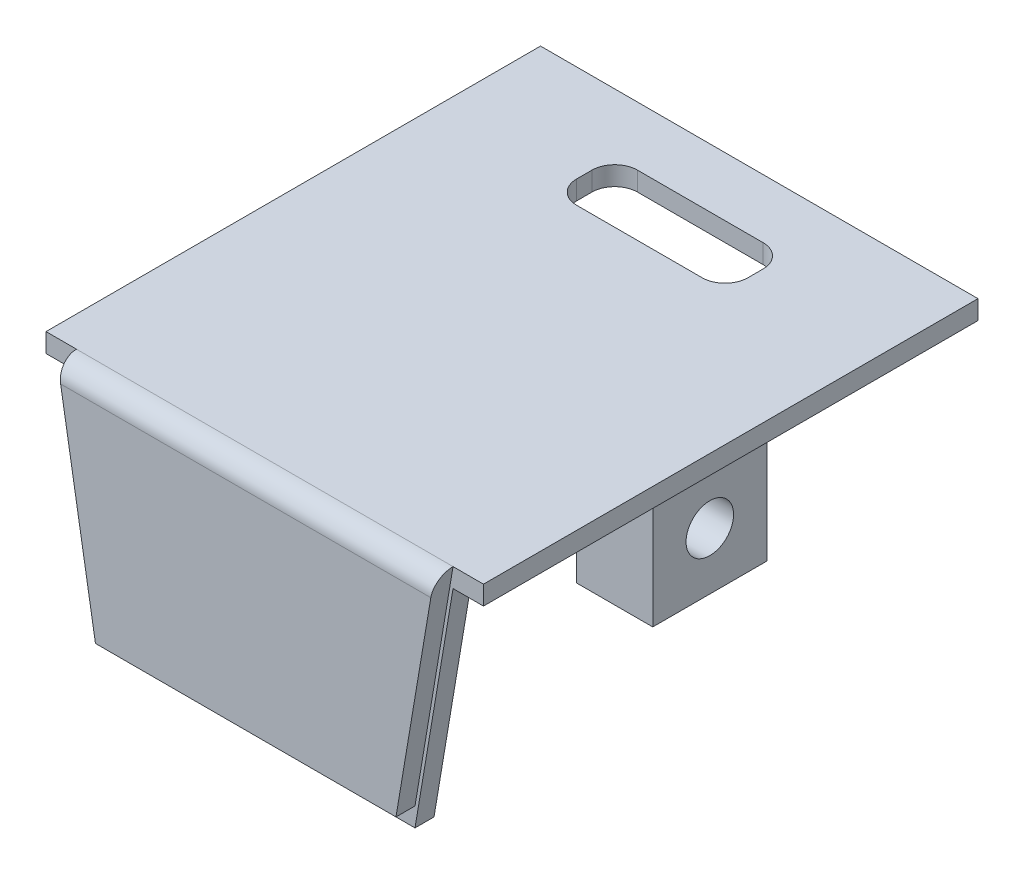
ISO-10303-21;
HEADER;
FILE_DESCRIPTION(('STEP AP214'),'2;1');
FILE_NAME('part.step','',(''),(''),'','','');
FILE_SCHEMA(('AUTOMOTIVE_DESIGN { 1 0 10303 214 1 1 1 1 }'));
ENDSEC;
DATA;
#1=APPLICATION_CONTEXT('core data for automotive mechanical design processes');
#2=APPLICATION_PROTOCOL_DEFINITION('international standard','automotive_design',2000,#1);
#3=PRODUCT_CONTEXT('',#1,'mechanical');
#4=PRODUCT('Part','Part','',(#3));
#5=PRODUCT_RELATED_PRODUCT_CATEGORY('part','',(#4));
#6=PRODUCT_DEFINITION_FORMATION('','',#4);
#7=PRODUCT_DEFINITION_CONTEXT('part definition',#1,'design');
#8=PRODUCT_DEFINITION('design','',#6,#7);
#9=PRODUCT_DEFINITION_SHAPE('','',#8);
#10=(LENGTH_UNIT() NAMED_UNIT(*) SI_UNIT(.MILLI.,.METRE.));
#11=(NAMED_UNIT(*) PLANE_ANGLE_UNIT() SI_UNIT($,.RADIAN.));
#12=(NAMED_UNIT(*) SI_UNIT($,.STERADIAN.) SOLID_ANGLE_UNIT());
#13=UNCERTAINTY_MEASURE_WITH_UNIT(LENGTH_MEASURE(1.E-05),#10,'distance_accuracy_value','');
#14=(GEOMETRIC_REPRESENTATION_CONTEXT(3) GLOBAL_UNCERTAINTY_ASSIGNED_CONTEXT((#13)) GLOBAL_UNIT_ASSIGNED_CONTEXT((#10,
#11,#12)) REPRESENTATION_CONTEXT('',''));
#15=CARTESIAN_POINT('',(0.,0.,0.));
#16=DIRECTION('',(0.,0.,1.));
#17=DIRECTION('',(1.,0.,0.));
#18=AXIS2_PLACEMENT_3D('',#15,#16,#17);
#19=CARTESIAN_POINT('',(0.,0.,0.));
#20=DIRECTION('',(0.,1.,0.));
#21=DIRECTION('',(0.,0.,1.));
#22=AXIS2_PLACEMENT_3D('',#19,#20,#21);
#23=PLANE('',#22);
#24=DIRECTION('',(-1.,0.,0.));
#25=VECTOR('',#24,1.);
#26=CARTESIAN_POINT('',(3.3,0.,-6.70000000000001));
#27=LINE('',#26,#25);
#28=CARTESIAN_POINT('',(3.3,0.,-6.70000000000001));
#29=VERTEX_POINT('',#28);
#30=CARTESIAN_POINT('',(-3.3,0.,-6.70000000000001));
#31=VERTEX_POINT('',#30);
#32=EDGE_CURVE('E605',#29,#31,#27,.T.);
#33=ORIENTED_EDGE('',*,*,#32,.F.);
#34=CARTESIAN_POINT('',(3.3,0.,-7.90000000000001));
#35=DIRECTION('',(0.,1.,0.));
#36=DIRECTION('',(0.,0.,1.));
#37=AXIS2_PLACEMENT_3D('',#34,#35,#36);
#38=CIRCLE('',#37,1.2);
#39=CARTESIAN_POINT('',(4.5,0.,-7.90000000000001));
#40=VERTEX_POINT('',#39);
#41=EDGE_CURVE('E282',#40,#29,#38,.F.);
#42=ORIENTED_EDGE('',*,*,#41,.F.);
#43=DIRECTION('',(0.,0.,1.));
#44=VECTOR('',#43,1.);
#45=CARTESIAN_POINT('',(4.5,0.,-8.70000000000001));
#46=LINE('',#45,#44);
#47=CARTESIAN_POINT('',(4.5,0.,-8.70000000000001));
#48=VERTEX_POINT('',#47);
#49=EDGE_CURVE('E279',#48,#40,#46,.T.);
#50=ORIENTED_EDGE('',*,*,#49,.F.);
#51=CARTESIAN_POINT('',(3.3,0.,-8.70000000000001));
#52=DIRECTION('',(0.,1.,0.));
#53=DIRECTION('',(0.,0.,1.));
#54=AXIS2_PLACEMENT_3D('',#51,#52,#53);
#55=CIRCLE('',#54,1.2);
#56=CARTESIAN_POINT('',(3.3,0.,-9.90000000000001));
#57=VERTEX_POINT('',#56);
#58=EDGE_CURVE('E231',#57,#48,#55,.F.);
#59=ORIENTED_EDGE('',*,*,#58,.F.);
#60=DIRECTION('',(1.,0.,0.));
#61=VECTOR('',#60,1.);
#62=CARTESIAN_POINT('',(3.3,0.,-9.90000000000001));
#63=LINE('',#62,#61);
#64=CARTESIAN_POINT('',(-3.3,0.,-9.90000000000001));
#65=VERTEX_POINT('',#64);
#66=EDGE_CURVE('E626',#65,#57,#63,.T.);
#67=ORIENTED_EDGE('',*,*,#66,.F.);
#68=CARTESIAN_POINT('',(-3.3,0.,-8.70000000000001));
#69=DIRECTION('',(0.,1.,0.));
#70=DIRECTION('',(0.,0.,1.));
#71=AXIS2_PLACEMENT_3D('',#68,#69,#70);
#72=CIRCLE('',#71,1.2);
#73=CARTESIAN_POINT('',(-4.5,0.,-8.70000000000001));
#74=VERTEX_POINT('',#73);
#75=EDGE_CURVE('E618',#74,#65,#72,.F.);
#76=ORIENTED_EDGE('',*,*,#75,.F.);
#77=DIRECTION('',(0.,0.,-1.));
#78=VECTOR('',#77,1.);
#79=CARTESIAN_POINT('',(-4.5,0.,-8.70000000000001));
#80=LINE('',#79,#78);
#81=CARTESIAN_POINT('',(-4.5,0.,-7.90000000000001));
#82=VERTEX_POINT('',#81);
#83=EDGE_CURVE('E616',#82,#74,#80,.T.);
#84=ORIENTED_EDGE('',*,*,#83,.F.);
#85=CARTESIAN_POINT('',(-3.3,0.,-7.90000000000001));
#86=DIRECTION('',(0.,1.,0.));
#87=DIRECTION('',(0.,0.,1.));
#88=AXIS2_PLACEMENT_3D('',#85,#86,#87);
#89=CIRCLE('',#88,1.2);
#90=EDGE_CURVE('E609',#31,#82,#89,.F.);
#91=ORIENTED_EDGE('',*,*,#90,.F.);
#92=EDGE_LOOP('',(#33,#42,#50,#59,#67,#76,#84,#91));
#93=FACE_BOUND('',#92,.T.);
#94=DIRECTION('',(0.,0.,1.));
#95=VECTOR('',#94,1.);
#96=CARTESIAN_POINT('',(10.4,0.,-3.));
#97=LINE('',#96,#95);
#98=CARTESIAN_POINT('',(10.4,0.,-3.));
#99=VERTEX_POINT('',#98);
#100=CARTESIAN_POINT('',(10.4,0.,3.));
#101=VERTEX_POINT('',#100);
#102=EDGE_CURVE('E375',#99,#101,#97,.T.);
#103=ORIENTED_EDGE('',*,*,#102,.F.);
#104=DIRECTION('',(1.,0.,0.));
#105=VECTOR('',#104,1.);
#106=CARTESIAN_POINT('',(6.4,0.,-3.));
#107=LINE('',#106,#105);
#108=CARTESIAN_POINT('',(6.4,0.,-3.));
#109=VERTEX_POINT('',#108);
#110=EDGE_CURVE('E380',#109,#99,#107,.T.);
#111=ORIENTED_EDGE('',*,*,#110,.F.);
#112=DIRECTION('',(0.,0.,-1.));
#113=VECTOR('',#112,1.);
#114=CARTESIAN_POINT('',(6.4,0.,-3.));
#115=LINE('',#114,#113);
#116=CARTESIAN_POINT('',(6.4,0.,3.));
#117=VERTEX_POINT('',#116);
#118=EDGE_CURVE('E392',#117,#109,#115,.T.);
#119=ORIENTED_EDGE('',*,*,#118,.F.);
#120=DIRECTION('',(-1.,0.,0.));
#121=VECTOR('',#120,1.);
#122=CARTESIAN_POINT('',(6.4,0.,3.));
#123=LINE('',#122,#121);
#124=EDGE_CURVE('E389',#101,#117,#123,.T.);
#125=ORIENTED_EDGE('',*,*,#124,.F.);
#126=EDGE_LOOP('',(#103,#111,#119,#125));
#127=FACE_BOUND('',#126,.T.);
#128=DIRECTION('',(-1.,0.,0.));
#129=VECTOR('',#128,1.);
#130=CARTESIAN_POINT('',(-6.4,0.,-3.));
#131=LINE('',#130,#129);
#132=CARTESIAN_POINT('',(-6.4,0.,-3.));
#133=VERTEX_POINT('',#132);
#134=CARTESIAN_POINT('',(-10.4,0.,-3.));
#135=VERTEX_POINT('',#134);
#136=EDGE_CURVE('E353',#133,#135,#131,.T.);
#137=ORIENTED_EDGE('',*,*,#136,.T.);
#138=DIRECTION('',(0.,0.,1.));
#139=VECTOR('',#138,1.);
#140=CARTESIAN_POINT('',(-10.4,0.,-3.));
#141=LINE('',#140,#139);
#142=CARTESIAN_POINT('',(-10.4,0.,3.));
#143=VERTEX_POINT('',#142);
#144=EDGE_CURVE('E336',#135,#143,#141,.T.);
#145=ORIENTED_EDGE('',*,*,#144,.T.);
#146=DIRECTION('',(1.,0.,0.));
#147=VECTOR('',#146,1.);
#148=CARTESIAN_POINT('',(-6.4,0.,3.));
#149=LINE('',#148,#147);
#150=CARTESIAN_POINT('',(-6.4,0.,3.));
#151=VERTEX_POINT('',#150);
#152=EDGE_CURVE('E341',#143,#151,#149,.T.);
#153=ORIENTED_EDGE('',*,*,#152,.T.);
#154=DIRECTION('',(0.,0.,-1.));
#155=VECTOR('',#154,1.);
#156=CARTESIAN_POINT('',(-6.4,0.,-3.));
#157=LINE('',#156,#155);
#158=EDGE_CURVE('E356',#151,#133,#157,.T.);
#159=ORIENTED_EDGE('',*,*,#158,.T.);
#160=EDGE_LOOP('',(#137,#145,#153,#159));
#161=FACE_BOUND('',#160,.T.);
#162=DIRECTION('',(0.,0.,1.));
#163=VECTOR('',#162,1.);
#164=CARTESIAN_POINT('',(9.90000000000001,0.,12.));
#165=LINE('',#164,#163);
#166=CARTESIAN_POINT('',(9.90000000000001,0.,12.));
#167=VERTEX_POINT('',#166);
#168=CARTESIAN_POINT('',(9.90000000000001,0.,13.));
#169=VERTEX_POINT('',#168);
#170=EDGE_CURVE('E293',#167,#169,#165,.T.);
#171=ORIENTED_EDGE('',*,*,#170,.F.);
#172=DIRECTION('',(1.,0.,0.));
#173=VECTOR('',#172,1.);
#174=CARTESIAN_POINT('',(9.90000000000001,0.,12.));
#175=LINE('',#174,#173);
#176=CARTESIAN_POINT('',(-9.90000000000001,0.,12.));
#177=VERTEX_POINT('',#176);
#178=EDGE_CURVE('E291',#177,#167,#175,.T.);
#179=ORIENTED_EDGE('',*,*,#178,.F.);
#180=DIRECTION('',(0.,0.,1.));
#181=VECTOR('',#180,1.);
#182=CARTESIAN_POINT('',(-9.90000000000001,0.,12.));
#183=LINE('',#182,#181);
#184=CARTESIAN_POINT('',(-9.90000000000001,0.,13.));
#185=VERTEX_POINT('',#184);
#186=EDGE_CURVE('E300',#177,#185,#183,.T.);
#187=ORIENTED_EDGE('',*,*,#186,.T.);
#188=DIRECTION('',(1.,0.,0.));
#189=VECTOR('',#188,1.);
#190=CARTESIAN_POINT('',(-11.5,0.,13.));
#191=LINE('',#190,#189);
#192=CARTESIAN_POINT('',(-11.5,0.,13.));
#193=VERTEX_POINT('',#192);
#194=EDGE_CURVE('E425',#193,#185,#191,.T.);
#195=ORIENTED_EDGE('',*,*,#194,.F.);
#196=DIRECTION('',(0.,0.,1.));
#197=VECTOR('',#196,1.);
#198=CARTESIAN_POINT('',(-11.5,0.,13.));
#199=LINE('',#198,#197);
#200=CARTESIAN_POINT('',(-11.5,0.,-13.));
#201=VERTEX_POINT('',#200);
#202=EDGE_CURVE('E408',#201,#193,#199,.T.);
#203=ORIENTED_EDGE('',*,*,#202,.F.);
#204=DIRECTION('',(-1.,0.,0.));
#205=VECTOR('',#204,1.);
#206=CARTESIAN_POINT('',(11.5,0.,-13.));
#207=LINE('',#206,#205);
#208=CARTESIAN_POINT('',(11.5,0.,-13.));
#209=VERTEX_POINT('',#208);
#210=EDGE_CURVE('E413',#209,#201,#207,.T.);
#211=ORIENTED_EDGE('',*,*,#210,.F.);
#212=DIRECTION('',(0.,0.,-1.));
#213=VECTOR('',#212,1.);
#214=CARTESIAN_POINT('',(11.5,0.,13.));
#215=LINE('',#214,#213);
#216=CARTESIAN_POINT('',(11.5,0.,13.));
#217=VERTEX_POINT('',#216);
#218=EDGE_CURVE('E428',#217,#209,#215,.T.);
#219=ORIENTED_EDGE('',*,*,#218,.F.);
#220=EDGE_CURVE('E424',#169,#217,#191,.T.);
#221=ORIENTED_EDGE('',*,*,#220,.F.);
#222=EDGE_LOOP('',(#171,#179,#187,#195,#203,#211,#219,#221));
#223=FACE_BOUND('',#222,.T.);
#224=ADVANCED_FACE('F37',(#93,#127,#161,#223),#23,.F.);
#225=CARTESIAN_POINT('',(-11.5,1.,13.));
#226=DIRECTION('',(0.,0.,-1.));
#227=DIRECTION('',(-1.,0.,0.));
#228=AXIS2_PLACEMENT_3D('',#225,#226,#227);
#229=PLANE('',#228);
#230=DIRECTION('',(0.165742694417267,0.986169031782739,0.));
#231=VECTOR('',#230,1.);
#232=CARTESIAN_POINT('',(9.90000000000001,1.,13.));
#233=LINE('',#232,#231);
#234=CARTESIAN_POINT('',(7.90000000000001,-10.9,13.));
#235=VERTEX_POINT('',#234);
#236=CARTESIAN_POINT('',(9.90000000000001,1.,13.));
#237=VERTEX_POINT('',#236);
#238=EDGE_CURVE('E321',#235,#237,#233,.T.);
#239=ORIENTED_EDGE('',*,*,#238,.F.);
#240=DIRECTION('',(1.,0.,0.));
#241=VECTOR('',#240,1.);
#242=CARTESIAN_POINT('',(-7.9,-10.9,13.));
#243=LINE('',#242,#241);
#244=CARTESIAN_POINT('',(-7.9,-10.9,13.));
#245=VERTEX_POINT('',#244);
#246=EDGE_CURVE('E313',#245,#235,#243,.T.);
#247=ORIENTED_EDGE('',*,*,#246,.F.);
#248=DIRECTION('',(0.165742694417267,-0.986169031782739,0.));
#249=VECTOR('',#248,1.);
#250=CARTESIAN_POINT('',(-9.9,1.,13.));
#251=LINE('',#250,#249);
#252=CARTESIAN_POINT('',(-9.9,1.,13.));
#253=VERTEX_POINT('',#252);
#254=EDGE_CURVE('E309',#253,#245,#251,.T.);
#255=ORIENTED_EDGE('',*,*,#254,.F.);
#256=DIRECTION('',(1.,0.,0.));
#257=VECTOR('',#256,1.);
#258=CARTESIAN_POINT('',(-11.5,1.,13.));
#259=LINE('',#258,#257);
#260=CARTESIAN_POINT('',(-11.5,1.,13.));
#261=VERTEX_POINT('',#260);
#262=EDGE_CURVE('E414',#261,#253,#259,.T.);
#263=ORIENTED_EDGE('',*,*,#262,.F.);
#264=DIRECTION('',(0.,-1.,0.));
#265=VECTOR('',#264,1.);
#266=CARTESIAN_POINT('',(-11.5,1.,13.));
#267=LINE('',#266,#265);
#268=EDGE_CURVE('E324',#261,#193,#267,.T.);
#269=ORIENTED_EDGE('',*,*,#268,.T.);
#270=ORIENTED_EDGE('',*,*,#194,.T.);
#271=DIRECTION('',(-0.165742694417268,0.986169031782739,0.));
#272=VECTOR('',#271,1.);
#273=CARTESIAN_POINT('',(-7.90000000000001,-11.9,13.));
#274=LINE('',#273,#272);
#275=CARTESIAN_POINT('',(-7.90000000000001,-11.9,13.));
#276=VERTEX_POINT('',#275);
#277=EDGE_CURVE('E287',#276,#185,#274,.T.);
#278=ORIENTED_EDGE('',*,*,#277,.F.);
#279=DIRECTION('',(-1.,0.,0.));
#280=VECTOR('',#279,1.);
#281=CARTESIAN_POINT('',(7.90000000000001,-11.9,13.));
#282=LINE('',#281,#280);
#283=CARTESIAN_POINT('',(7.90000000000001,-11.9,13.));
#284=VERTEX_POINT('',#283);
#285=EDGE_CURVE('E296',#284,#276,#282,.T.);
#286=ORIENTED_EDGE('',*,*,#285,.F.);
#287=DIRECTION('',(-0.165742694417268,-0.986169031782739,0.));
#288=VECTOR('',#287,1.);
#289=CARTESIAN_POINT('',(7.90000000000001,-11.9,13.));
#290=LINE('',#289,#288);
#291=EDGE_CURVE('E281',#169,#284,#290,.T.);
#292=ORIENTED_EDGE('',*,*,#291,.F.);
#293=ORIENTED_EDGE('',*,*,#220,.T.);
#294=DIRECTION('',(0.,-1.,0.));
#295=VECTOR('',#294,1.);
#296=CARTESIAN_POINT('',(11.5,1.,13.));
#297=LINE('',#296,#295);
#298=CARTESIAN_POINT('',(11.5,1.,13.));
#299=VERTEX_POINT('',#298);
#300=EDGE_CURVE('E436',#299,#217,#297,.T.);
#301=ORIENTED_EDGE('',*,*,#300,.F.);
#302=EDGE_CURVE('E412',#237,#299,#259,.T.);
#303=ORIENTED_EDGE('',*,*,#302,.F.);
#304=EDGE_LOOP('',(#239,#247,#255,#263,#269,#270,#278,#286,#292,#293,#301,#303));
#305=FACE_BOUND('',#304,.T.);
#306=ADVANCED_FACE('F445',(#305),#229,.F.);
#307=CARTESIAN_POINT('',(-11.5,1.,13.));
#308=DIRECTION('',(1.,0.,0.));
#309=DIRECTION('',(0.,0.,-1.));
#310=AXIS2_PLACEMENT_3D('',#307,#308,#309);
#311=PLANE('',#310);
#312=ORIENTED_EDGE('',*,*,#202,.T.);
#313=ORIENTED_EDGE('',*,*,#268,.F.);
#314=DIRECTION('',(0.,0.,1.));
#315=VECTOR('',#314,1.);
#316=CARTESIAN_POINT('',(-11.5,1.,13.));
#317=LINE('',#316,#315);
#318=CARTESIAN_POINT('',(-11.5,1.,-13.));
#319=VERTEX_POINT('',#318);
#320=EDGE_CURVE('E409',#319,#261,#317,.T.);
#321=ORIENTED_EDGE('',*,*,#320,.F.);
#322=DIRECTION('',(0.,-1.,0.));
#323=VECTOR('',#322,1.);
#324=CARTESIAN_POINT('',(-11.5,1.,-13.));
#325=LINE('',#324,#323);
#326=EDGE_CURVE('E421',#319,#201,#325,.T.);
#327=ORIENTED_EDGE('',*,*,#326,.T.);
#328=EDGE_LOOP('',(#312,#313,#321,#327));
#329=FACE_BOUND('',#328,.T.);
#330=ADVANCED_FACE('F465',(#329),#311,.F.);
#331=CARTESIAN_POINT('',(11.5,1.,13.));
#332=DIRECTION('',(-1.,0.,0.));
#333=DIRECTION('',(0.,0.,1.));
#334=AXIS2_PLACEMENT_3D('',#331,#332,#333);
#335=PLANE('',#334);
#336=ORIENTED_EDGE('',*,*,#218,.T.);
#337=DIRECTION('',(0.,-1.,0.));
#338=VECTOR('',#337,1.);
#339=CARTESIAN_POINT('',(11.5,1.,-13.));
#340=LINE('',#339,#338);
#341=CARTESIAN_POINT('',(11.5,1.,-13.));
#342=VERTEX_POINT('',#341);
#343=EDGE_CURVE('E433',#342,#209,#340,.T.);
#344=ORIENTED_EDGE('',*,*,#343,.F.);
#345=DIRECTION('',(0.,0.,-1.));
#346=VECTOR('',#345,1.);
#347=CARTESIAN_POINT('',(11.5,1.,13.));
#348=LINE('',#347,#346);
#349=EDGE_CURVE('E417',#299,#342,#348,.T.);
#350=ORIENTED_EDGE('',*,*,#349,.F.);
#351=ORIENTED_EDGE('',*,*,#300,.T.);
#352=EDGE_LOOP('',(#336,#344,#350,#351));
#353=FACE_BOUND('',#352,.T.);
#354=ADVANCED_FACE('F488',(#353),#335,.F.);
#355=CARTESIAN_POINT('',(11.5,1.,-13.));
#356=DIRECTION('',(0.,0.,1.));
#357=DIRECTION('',(1.,0.,0.));
#358=AXIS2_PLACEMENT_3D('',#355,#356,#357);
#359=PLANE('',#358);
#360=ORIENTED_EDGE('',*,*,#210,.T.);
#361=ORIENTED_EDGE('',*,*,#326,.F.);
#362=DIRECTION('',(-1.,0.,0.));
#363=VECTOR('',#362,1.);
#364=CARTESIAN_POINT('',(11.5,1.,-13.));
#365=LINE('',#364,#363);
#366=EDGE_CURVE('E419',#342,#319,#365,.T.);
#367=ORIENTED_EDGE('',*,*,#366,.F.);
#368=ORIENTED_EDGE('',*,*,#343,.T.);
#369=EDGE_LOOP('',(#360,#361,#367,#368));
#370=FACE_BOUND('',#369,.T.);
#371=ADVANCED_FACE('F490',(#370),#359,.F.);
#372=CARTESIAN_POINT('',(0.,1.,0.));
#373=DIRECTION('',(0.,1.,0.));
#374=DIRECTION('',(0.,0.,1.));
#375=AXIS2_PLACEMENT_3D('',#372,#373,#374);
#376=PLANE('',#375);
#377=CARTESIAN_POINT('',(3.3,1.,-7.90000000000001));
#378=DIRECTION('',(0.,1.,0.));
#379=DIRECTION('',(0.,0.,-1.));
#380=AXIS2_PLACEMENT_3D('',#377,#378,#379);
#381=CIRCLE('',#380,1.2);
#382=CARTESIAN_POINT('',(3.3,1.,-6.70000000000001));
#383=VERTEX_POINT('',#382);
#384=CARTESIAN_POINT('',(4.5,1.,-7.90000000000001));
#385=VERTEX_POINT('',#384);
#386=EDGE_CURVE('E244',#383,#385,#381,.T.);
#387=ORIENTED_EDGE('',*,*,#386,.F.);
#388=DIRECTION('',(1.,0.,0.));
#389=VECTOR('',#388,1.);
#390=CARTESIAN_POINT('',(3.3,1.,-6.70000000000001));
#391=LINE('',#390,#389);
#392=CARTESIAN_POINT('',(-3.3,1.,-6.70000000000001));
#393=VERTEX_POINT('',#392);
#394=EDGE_CURVE('E264',#393,#383,#391,.T.);
#395=ORIENTED_EDGE('',*,*,#394,.F.);
#396=CARTESIAN_POINT('',(-3.3,1.,-7.90000000000001));
#397=DIRECTION('',(0.,1.,0.));
#398=DIRECTION('',(0.,0.,-1.));
#399=AXIS2_PLACEMENT_3D('',#396,#397,#398);
#400=CIRCLE('',#399,1.2);
#401=CARTESIAN_POINT('',(-4.5,1.,-7.90000000000001));
#402=VERTEX_POINT('',#401);
#403=EDGE_CURVE('E261',#402,#393,#400,.T.);
#404=ORIENTED_EDGE('',*,*,#403,.F.);
#405=DIRECTION('',(0.,0.,1.));
#406=VECTOR('',#405,1.);
#407=CARTESIAN_POINT('',(-4.5,1.,-8.70000000000001));
#408=LINE('',#407,#406);
#409=CARTESIAN_POINT('',(-4.5,1.,-8.70000000000001));
#410=VERTEX_POINT('',#409);
#411=EDGE_CURVE('E258',#410,#402,#408,.T.);
#412=ORIENTED_EDGE('',*,*,#411,.F.);
#413=CARTESIAN_POINT('',(-3.3,1.,-8.70000000000001));
#414=DIRECTION('',(0.,1.,0.));
#415=DIRECTION('',(0.,0.,1.));
#416=AXIS2_PLACEMENT_3D('',#413,#414,#415);
#417=CIRCLE('',#416,1.2);
#418=CARTESIAN_POINT('',(-3.3,1.,-9.90000000000001));
#419=VERTEX_POINT('',#418);
#420=EDGE_CURVE('E252',#419,#410,#417,.T.);
#421=ORIENTED_EDGE('',*,*,#420,.F.);
#422=DIRECTION('',(-1.,0.,0.));
#423=VECTOR('',#422,1.);
#424=CARTESIAN_POINT('',(3.3,1.,-9.90000000000001));
#425=LINE('',#424,#423);
#426=CARTESIAN_POINT('',(3.3,1.,-9.90000000000001));
#427=VERTEX_POINT('',#426);
#428=EDGE_CURVE('E250',#427,#419,#425,.T.);
#429=ORIENTED_EDGE('',*,*,#428,.F.);
#430=CARTESIAN_POINT('',(3.3,1.,-8.70000000000001));
#431=DIRECTION('',(0.,1.,0.));
#432=DIRECTION('',(0.,0.,-1.));
#433=AXIS2_PLACEMENT_3D('',#430,#431,#432);
#434=CIRCLE('',#433,1.2);
#435=CARTESIAN_POINT('',(4.5,1.,-8.70000000000001));
#436=VERTEX_POINT('',#435);
#437=EDGE_CURVE('E228',#436,#427,#434,.T.);
#438=ORIENTED_EDGE('',*,*,#437,.F.);
#439=DIRECTION('',(0.,0.,-1.));
#440=VECTOR('',#439,1.);
#441=CARTESIAN_POINT('',(4.5,1.,-8.70000000000001));
#442=LINE('',#441,#440);
#443=EDGE_CURVE('E239',#385,#436,#442,.T.);
#444=ORIENTED_EDGE('',*,*,#443,.F.);
#445=EDGE_LOOP('',(#387,#395,#404,#412,#421,#429,#438,#444));
#446=FACE_BOUND('',#445,.T.);
#447=ORIENTED_EDGE('',*,*,#262,.T.);
#448=DIRECTION('',(-1.,0.,0.));
#449=VECTOR('',#448,1.);
#450=CARTESIAN_POINT('',(0.,1.,13.));
#451=LINE('',#450,#449);
#452=EDGE_CURVE('E45',#253,#237,#451,.F.);
#453=ORIENTED_EDGE('',*,*,#452,.T.);
#454=ORIENTED_EDGE('',*,*,#302,.T.);
#455=ORIENTED_EDGE('',*,*,#349,.T.);
#456=ORIENTED_EDGE('',*,*,#366,.T.);
#457=ORIENTED_EDGE('',*,*,#320,.T.);
#458=EDGE_LOOP('',(#447,#453,#454,#455,#456,#457));
#459=FACE_BOUND('',#458,.T.);
#460=ADVANCED_FACE('F246',(#446,#459),#376,.T.);
#461=CARTESIAN_POINT('',(10.4,-6.5,-3.));
#462=DIRECTION('',(-1.,0.,0.));
#463=DIRECTION('',(0.,0.,1.));
#464=AXIS2_PLACEMENT_3D('',#461,#462,#463);
#465=PLANE('',#464);
#466=CARTESIAN_POINT('',(10.4,-3.5,0.));
#467=DIRECTION('',(1.,0.,0.));
#468=DIRECTION('',(0.,0.,-1.));
#469=AXIS2_PLACEMENT_3D('',#466,#467,#468);
#470=CIRCLE('',#469,1.25);
#471=CARTESIAN_POINT('',(10.4,-3.5,-1.25));
#472=VERTEX_POINT('',#471);
#473=EDGE_CURVE('E369',#472,#472,#470,.T.);
#474=ORIENTED_EDGE('',*,*,#473,.F.);
#475=EDGE_LOOP('',(#474));
#476=FACE_BOUND('',#475,.T.);
#477=ORIENTED_EDGE('',*,*,#102,.T.);
#478=DIRECTION('',(0.,1.,0.));
#479=VECTOR('',#478,1.);
#480=CARTESIAN_POINT('',(10.4,-6.5,3.));
#481=LINE('',#480,#479);
#482=CARTESIAN_POINT('',(10.4,-6.5,3.));
#483=VERTEX_POINT('',#482);
#484=EDGE_CURVE('E405',#483,#101,#481,.T.);
#485=ORIENTED_EDGE('',*,*,#484,.F.);
#486=DIRECTION('',(0.,0.,1.));
#487=VECTOR('',#486,1.);
#488=CARTESIAN_POINT('',(10.4,-6.5,-3.));
#489=LINE('',#488,#487);
#490=CARTESIAN_POINT('',(10.4,-6.5,-3.));
#491=VERTEX_POINT('',#490);
#492=EDGE_CURVE('E376',#491,#483,#489,.T.);
#493=ORIENTED_EDGE('',*,*,#492,.F.);
#494=DIRECTION('',(0.,1.,0.));
#495=VECTOR('',#494,1.);
#496=CARTESIAN_POINT('',(10.4,-6.5,-3.));
#497=LINE('',#496,#495);
#498=EDGE_CURVE('E386',#491,#99,#497,.T.);
#499=ORIENTED_EDGE('',*,*,#498,.T.);
#500=EDGE_LOOP('',(#477,#485,#493,#499));
#501=FACE_BOUND('',#500,.T.);
#502=ADVANCED_FACE('F497',(#476,#501),#465,.F.);
#503=CARTESIAN_POINT('',(6.4,-6.5,3.));
#504=DIRECTION('',(0.,0.,-1.));
#505=DIRECTION('',(-1.,0.,0.));
#506=AXIS2_PLACEMENT_3D('',#503,#504,#505);
#507=PLANE('',#506);
#508=ORIENTED_EDGE('',*,*,#124,.T.);
#509=DIRECTION('',(0.,1.,0.));
#510=VECTOR('',#509,1.);
#511=CARTESIAN_POINT('',(6.4,-6.5,3.));
#512=LINE('',#511,#510);
#513=CARTESIAN_POINT('',(6.4,-6.5,3.));
#514=VERTEX_POINT('',#513);
#515=EDGE_CURVE('E402',#514,#117,#512,.T.);
#516=ORIENTED_EDGE('',*,*,#515,.F.);
#517=DIRECTION('',(-1.,0.,0.));
#518=VECTOR('',#517,1.);
#519=CARTESIAN_POINT('',(6.4,-6.5,3.));
#520=LINE('',#519,#518);
#521=EDGE_CURVE('E379',#483,#514,#520,.T.);
#522=ORIENTED_EDGE('',*,*,#521,.F.);
#523=ORIENTED_EDGE('',*,*,#484,.T.);
#524=EDGE_LOOP('',(#508,#516,#522,#523));
#525=FACE_BOUND('',#524,.T.);
#526=ADVANCED_FACE('F512',(#525),#507,.F.);
#527=CARTESIAN_POINT('',(6.4,-6.5,-3.));
#528=DIRECTION('',(1.,0.,0.));
#529=DIRECTION('',(0.,0.,-1.));
#530=AXIS2_PLACEMENT_3D('',#527,#528,#529);
#531=PLANE('',#530);
#532=CARTESIAN_POINT('',(6.4,-3.5,0.));
#533=DIRECTION('',(1.,0.,0.));
#534=DIRECTION('',(0.,0.,-1.));
#535=AXIS2_PLACEMENT_3D('',#532,#533,#534);
#536=CIRCLE('',#535,1.25);
#537=CARTESIAN_POINT('',(6.4,-3.5,-1.25));
#538=VERTEX_POINT('',#537);
#539=EDGE_CURVE('E372',#538,#538,#536,.F.);
#540=ORIENTED_EDGE('',*,*,#539,.F.);
#541=EDGE_LOOP('',(#540));
#542=FACE_BOUND('',#541,.T.);
#543=ORIENTED_EDGE('',*,*,#118,.T.);
#544=DIRECTION('',(0.,1.,0.));
#545=VECTOR('',#544,1.);
#546=CARTESIAN_POINT('',(6.4,-6.5,-3.));
#547=LINE('',#546,#545);
#548=CARTESIAN_POINT('',(6.4,-6.5,-3.));
#549=VERTEX_POINT('',#548);
#550=EDGE_CURVE('E399',#549,#109,#547,.T.);
#551=ORIENTED_EDGE('',*,*,#550,.F.);
#552=DIRECTION('',(0.,0.,-1.));
#553=VECTOR('',#552,1.);
#554=CARTESIAN_POINT('',(6.4,-6.5,-3.));
#555=LINE('',#554,#553);
#556=EDGE_CURVE('E382',#514,#549,#555,.T.);
#557=ORIENTED_EDGE('',*,*,#556,.F.);
#558=ORIENTED_EDGE('',*,*,#515,.T.);
#559=EDGE_LOOP('',(#543,#551,#557,#558));
#560=FACE_BOUND('',#559,.T.);
#561=ADVANCED_FACE('F516',(#542,#560),#531,.F.);
#562=CARTESIAN_POINT('',(6.4,-6.5,-3.));
#563=DIRECTION('',(0.,0.,1.));
#564=DIRECTION('',(1.,0.,0.));
#565=AXIS2_PLACEMENT_3D('',#562,#563,#564);
#566=PLANE('',#565);
#567=ORIENTED_EDGE('',*,*,#110,.T.);
#568=ORIENTED_EDGE('',*,*,#498,.F.);
#569=DIRECTION('',(1.,0.,0.));
#570=VECTOR('',#569,1.);
#571=CARTESIAN_POINT('',(6.4,-6.5,-3.));
#572=LINE('',#571,#570);
#573=EDGE_CURVE('E384',#549,#491,#572,.T.);
#574=ORIENTED_EDGE('',*,*,#573,.F.);
#575=ORIENTED_EDGE('',*,*,#550,.T.);
#576=EDGE_LOOP('',(#567,#568,#574,#575));
#577=FACE_BOUND('',#576,.T.);
#578=ADVANCED_FACE('F520',(#577),#566,.F.);
#579=CARTESIAN_POINT('',(0.,-6.5,0.));
#580=DIRECTION('',(0.,1.,0.));
#581=DIRECTION('',(0.,0.,1.));
#582=AXIS2_PLACEMENT_3D('',#579,#580,#581);
#583=PLANE('',#582);
#584=ORIENTED_EDGE('',*,*,#492,.T.);
#585=ORIENTED_EDGE('',*,*,#521,.T.);
#586=ORIENTED_EDGE('',*,*,#556,.T.);
#587=ORIENTED_EDGE('',*,*,#573,.T.);
#588=EDGE_LOOP('',(#584,#585,#586,#587));
#589=FACE_BOUND('',#588,.T.);
#590=ADVANCED_FACE('F524',(#589),#583,.F.);
#591=CARTESIAN_POINT('',(2.86446609406727,-3.5,0.));
#592=DIRECTION('',(1.,0.,0.));
#593=DIRECTION('',(0.,0.,-1.));
#594=AXIS2_PLACEMENT_3D('',#591,#592,#593);
#595=CYLINDRICAL_SURFACE('',#594,1.25);
#596=ORIENTED_EDGE('',*,*,#539,.T.);
#597=EDGE_LOOP('',(#596));
#598=FACE_BOUND('',#597,.T.);
#599=ORIENTED_EDGE('',*,*,#473,.T.);
#600=EDGE_LOOP('',(#599));
#601=FACE_BOUND('',#600,.T.);
#602=ADVANCED_FACE('F528',(#598,#601),#595,.F.);
#603=CARTESIAN_POINT('',(-10.4,-6.5,-3.));
#604=DIRECTION('',(-1.,0.,0.));
#605=DIRECTION('',(0.,0.,1.));
#606=AXIS2_PLACEMENT_3D('',#603,#604,#605);
#607=PLANE('',#606);
#608=CARTESIAN_POINT('',(-10.4,-3.5,0.));
#609=DIRECTION('',(1.,0.,0.));
#610=DIRECTION('',(0.,0.,-1.));
#611=AXIS2_PLACEMENT_3D('',#608,#609,#610);
#612=CIRCLE('',#611,1.25);
#613=CARTESIAN_POINT('',(-10.4,-3.5,1.25));
#614=VERTEX_POINT('',#613);
#615=EDGE_CURVE('E330',#614,#614,#612,.T.);
#616=ORIENTED_EDGE('',*,*,#615,.T.);
#617=EDGE_LOOP('',(#616));
#618=FACE_BOUND('',#617,.T.);
#619=ORIENTED_EDGE('',*,*,#144,.F.);
#620=DIRECTION('',(0.,1.,0.));
#621=VECTOR('',#620,1.);
#622=CARTESIAN_POINT('',(-10.4,-6.5,-3.));
#623=LINE('',#622,#621);
#624=CARTESIAN_POINT('',(-10.4,-6.5,-3.));
#625=VERTEX_POINT('',#624);
#626=EDGE_CURVE('E367',#625,#135,#623,.T.);
#627=ORIENTED_EDGE('',*,*,#626,.F.);
#628=DIRECTION('',(0.,0.,1.));
#629=VECTOR('',#628,1.);
#630=CARTESIAN_POINT('',(-10.4,-6.5,-3.));
#631=LINE('',#630,#629);
#632=CARTESIAN_POINT('',(-10.4,-6.5,3.));
#633=VERTEX_POINT('',#632);
#634=EDGE_CURVE('E337',#625,#633,#631,.T.);
#635=ORIENTED_EDGE('',*,*,#634,.T.);
#636=DIRECTION('',(0.,1.,0.));
#637=VECTOR('',#636,1.);
#638=CARTESIAN_POINT('',(-10.4,-6.5,3.));
#639=LINE('',#638,#637);
#640=EDGE_CURVE('E350',#633,#143,#639,.T.);
#641=ORIENTED_EDGE('',*,*,#640,.T.);
#642=EDGE_LOOP('',(#619,#627,#635,#641));
#643=FACE_BOUND('',#642,.T.);
#644=ADVANCED_FACE('F532',(#618,#643),#607,.T.);
#645=CARTESIAN_POINT('',(-6.4,-6.5,-3.));
#646=DIRECTION('',(0.,0.,-1.));
#647=DIRECTION('',(-1.,0.,0.));
#648=AXIS2_PLACEMENT_3D('',#645,#646,#647);
#649=PLANE('',#648);
#650=ORIENTED_EDGE('',*,*,#136,.F.);
#651=DIRECTION('',(0.,1.,0.));
#652=VECTOR('',#651,1.);
#653=CARTESIAN_POINT('',(-6.4,-6.5,-3.));
#654=LINE('',#653,#652);
#655=CARTESIAN_POINT('',(-6.4,-6.5,-3.));
#656=VERTEX_POINT('',#655);
#657=EDGE_CURVE('E365',#656,#133,#654,.T.);
#658=ORIENTED_EDGE('',*,*,#657,.F.);
#659=DIRECTION('',(-1.,0.,0.));
#660=VECTOR('',#659,1.);
#661=CARTESIAN_POINT('',(-6.4,-6.5,-3.));
#662=LINE('',#661,#660);
#663=EDGE_CURVE('E340',#656,#625,#662,.T.);
#664=ORIENTED_EDGE('',*,*,#663,.T.);
#665=ORIENTED_EDGE('',*,*,#626,.T.);
#666=EDGE_LOOP('',(#650,#658,#664,#665));
#667=FACE_BOUND('',#666,.T.);
#668=ADVANCED_FACE('F536',(#667),#649,.T.);
#669=CARTESIAN_POINT('',(-6.4,-6.5,-3.));
#670=DIRECTION('',(1.,0.,0.));
#671=DIRECTION('',(0.,0.,-1.));
#672=AXIS2_PLACEMENT_3D('',#669,#670,#671);
#673=PLANE('',#672);
#674=CARTESIAN_POINT('',(-6.4,-3.5,0.));
#675=DIRECTION('',(-1.,0.,0.));
#676=DIRECTION('',(0.,0.,1.));
#677=AXIS2_PLACEMENT_3D('',#674,#675,#676);
#678=CIRCLE('',#677,1.25);
#679=CARTESIAN_POINT('',(-6.4,-3.5,1.25));
#680=VERTEX_POINT('',#679);
#681=EDGE_CURVE('E333',#680,#680,#678,.T.);
#682=ORIENTED_EDGE('',*,*,#681,.T.);
#683=EDGE_LOOP('',(#682));
#684=FACE_BOUND('',#683,.T.);
#685=ORIENTED_EDGE('',*,*,#158,.F.);
#686=DIRECTION('',(0.,1.,0.));
#687=VECTOR('',#686,1.);
#688=CARTESIAN_POINT('',(-6.4,-6.5,3.));
#689=LINE('',#688,#687);
#690=CARTESIAN_POINT('',(-6.4,-6.5,3.));
#691=VERTEX_POINT('',#690);
#692=EDGE_CURVE('E362',#691,#151,#689,.T.);
#693=ORIENTED_EDGE('',*,*,#692,.F.);
#694=DIRECTION('',(0.,0.,-1.));
#695=VECTOR('',#694,1.);
#696=CARTESIAN_POINT('',(-6.4,-6.5,-3.));
#697=LINE('',#696,#695);
#698=EDGE_CURVE('E344',#691,#656,#697,.T.);
#699=ORIENTED_EDGE('',*,*,#698,.T.);
#700=ORIENTED_EDGE('',*,*,#657,.T.);
#701=EDGE_LOOP('',(#685,#693,#699,#700));
#702=FACE_BOUND('',#701,.T.);
#703=ADVANCED_FACE('F540',(#684,#702),#673,.T.);
#704=CARTESIAN_POINT('',(-6.4,-6.5,3.));
#705=DIRECTION('',(0.,0.,1.));
#706=DIRECTION('',(1.,0.,0.));
#707=AXIS2_PLACEMENT_3D('',#704,#705,#706);
#708=PLANE('',#707);
#709=ORIENTED_EDGE('',*,*,#152,.F.);
#710=ORIENTED_EDGE('',*,*,#640,.F.);
#711=DIRECTION('',(1.,0.,0.));
#712=VECTOR('',#711,1.);
#713=CARTESIAN_POINT('',(-6.4,-6.5,3.));
#714=LINE('',#713,#712);
#715=EDGE_CURVE('E347',#633,#691,#714,.T.);
#716=ORIENTED_EDGE('',*,*,#715,.T.);
#717=ORIENTED_EDGE('',*,*,#692,.T.);
#718=EDGE_LOOP('',(#709,#710,#716,#717));
#719=FACE_BOUND('',#718,.T.);
#720=ADVANCED_FACE('F544',(#719),#708,.T.);
#721=CARTESIAN_POINT('',(0.,-6.5,0.));
#722=DIRECTION('',(0.,1.,0.));
#723=DIRECTION('',(0.,0.,1.));
#724=AXIS2_PLACEMENT_3D('',#721,#722,#723);
#725=PLANE('',#724);
#726=ORIENTED_EDGE('',*,*,#634,.F.);
#727=ORIENTED_EDGE('',*,*,#663,.F.);
#728=ORIENTED_EDGE('',*,*,#698,.F.);
#729=ORIENTED_EDGE('',*,*,#715,.F.);
#730=EDGE_LOOP('',(#726,#727,#728,#729));
#731=FACE_BOUND('',#730,.T.);
#732=ADVANCED_FACE('F548',(#731),#725,.F.);
#733=CARTESIAN_POINT('',(9.93553390593273,-3.5,0.));
#734=DIRECTION('',(-1.,0.,0.));
#735=DIRECTION('',(0.,0.,1.));
#736=AXIS2_PLACEMENT_3D('',#733,#734,#735);
#737=CYLINDRICAL_SURFACE('',#736,1.25);
#738=CARTESIAN_POINT('',(-6.4,-3.5,1.25));
#739=CARTESIAN_POINT('',(-6.44166666666667,-3.5,1.25));
#740=CARTESIAN_POINT('',(-6.48333333333333,-3.5,1.25));
#741=CARTESIAN_POINT('',(-6.56666666666667,-3.5,1.25));
#742=CARTESIAN_POINT('',(-6.60833333333333,-3.5,1.25));
#743=CARTESIAN_POINT('',(-6.69166666666667,-3.5,1.25));
#744=CARTESIAN_POINT('',(-6.73333333333333,-3.5,1.25));
#745=CARTESIAN_POINT('',(-6.81666666666667,-3.5,1.25));
#746=CARTESIAN_POINT('',(-6.85833333333333,-3.5,1.25));
#747=CARTESIAN_POINT('',(-6.94166666666667,-3.5,1.25));
#748=CARTESIAN_POINT('',(-6.98333333333333,-3.5,1.25));
#749=CARTESIAN_POINT('',(-7.06666666666667,-3.5,1.25));
#750=CARTESIAN_POINT('',(-7.10833333333333,-3.5,1.25));
#751=CARTESIAN_POINT('',(-7.19166666666667,-3.5,1.25));
#752=CARTESIAN_POINT('',(-7.23333333333333,-3.5,1.25));
#753=CARTESIAN_POINT('',(-7.31666666666667,-3.5,1.25));
#754=CARTESIAN_POINT('',(-7.35833333333333,-3.5,1.25));
#755=CARTESIAN_POINT('',(-7.44166666666667,-3.5,1.25));
#756=CARTESIAN_POINT('',(-7.48333333333333,-3.5,1.25));
#757=CARTESIAN_POINT('',(-7.56666666666667,-3.5,1.25));
#758=CARTESIAN_POINT('',(-7.60833333333333,-3.5,1.25));
#759=CARTESIAN_POINT('',(-7.69166666666667,-3.5,1.25));
#760=CARTESIAN_POINT('',(-7.73333333333333,-3.5,1.25));
#761=CARTESIAN_POINT('',(-7.81666666666667,-3.5,1.25));
#762=CARTESIAN_POINT('',(-7.85833333333333,-3.5,1.25));
#763=CARTESIAN_POINT('',(-7.94166666666667,-3.5,1.25));
#764=CARTESIAN_POINT('',(-7.98333333333333,-3.5,1.25));
#765=CARTESIAN_POINT('',(-8.06666666666667,-3.5,1.25));
#766=CARTESIAN_POINT('',(-8.10833333333333,-3.5,1.25));
#767=CARTESIAN_POINT('',(-8.19166666666667,-3.5,1.25));
#768=CARTESIAN_POINT('',(-8.23333333333333,-3.5,1.25));
#769=CARTESIAN_POINT('',(-8.31666666666667,-3.5,1.25));
#770=CARTESIAN_POINT('',(-8.35833333333333,-3.5,1.25));
#771=CARTESIAN_POINT('',(-8.44166666666667,-3.5,1.25));
#772=CARTESIAN_POINT('',(-8.48333333333333,-3.5,1.25));
#773=CARTESIAN_POINT('',(-8.56666666666667,-3.5,1.25));
#774=CARTESIAN_POINT('',(-8.60833333333333,-3.5,1.25));
#775=CARTESIAN_POINT('',(-8.69166666666667,-3.5,1.25));
#776=CARTESIAN_POINT('',(-8.73333333333333,-3.5,1.25));
#777=CARTESIAN_POINT('',(-8.81666666666667,-3.5,1.25));
#778=CARTESIAN_POINT('',(-8.85833333333333,-3.5,1.25));
#779=CARTESIAN_POINT('',(-8.94166666666667,-3.5,1.25));
#780=CARTESIAN_POINT('',(-8.98333333333333,-3.5,1.25));
#781=CARTESIAN_POINT('',(-9.06666666666667,-3.5,1.25));
#782=CARTESIAN_POINT('',(-9.10833333333333,-3.5,1.25));
#783=CARTESIAN_POINT('',(-9.19166666666667,-3.5,1.25));
#784=CARTESIAN_POINT('',(-9.23333333333333,-3.5,1.25));
#785=CARTESIAN_POINT('',(-9.31666666666667,-3.5,1.25));
#786=CARTESIAN_POINT('',(-9.35833333333333,-3.5,1.25));
#787=CARTESIAN_POINT('',(-9.44166666666667,-3.5,1.25));
#788=CARTESIAN_POINT('',(-9.48333333333333,-3.5,1.25));
#789=CARTESIAN_POINT('',(-9.56666666666667,-3.5,1.25));
#790=CARTESIAN_POINT('',(-9.60833333333333,-3.5,1.25));
#791=CARTESIAN_POINT('',(-9.69166666666667,-3.5,1.25));
#792=CARTESIAN_POINT('',(-9.73333333333333,-3.5,1.25));
#793=CARTESIAN_POINT('',(-9.81666666666667,-3.5,1.25));
#794=CARTESIAN_POINT('',(-9.85833333333334,-3.5,1.25));
#795=CARTESIAN_POINT('',(-9.94166666666667,-3.5,1.25));
#796=CARTESIAN_POINT('',(-9.98333333333334,-3.5,1.25));
#797=CARTESIAN_POINT('',(-10.0666666666667,-3.5,1.25));
#798=CARTESIAN_POINT('',(-10.1083333333333,-3.5,1.25));
#799=CARTESIAN_POINT('',(-10.1916666666667,-3.5,1.25));
#800=CARTESIAN_POINT('',(-10.2333333333333,-3.5,1.25));
#801=CARTESIAN_POINT('',(-10.3166666666667,-3.5,1.25));
#802=CARTESIAN_POINT('',(-10.3583333333333,-3.5,1.25));
#803=CARTESIAN_POINT('',(-10.4,-3.5,1.25));
#804=B_SPLINE_CURVE_WITH_KNOTS('',3,(#738,#739,#740,#741,#742,#743,#744,#745,#746,#747,#748,
#749,#750,#751,#752,#753,#754,#755,#756,#757,#758,#759,#760,#761,#762,#763,#764,#765,#766,#767,
#768,#769,#770,#771,#772,#773,#774,#775,#776,#777,#778,#779,#780,#781,#782,#783,#784,#785,#786,
#787,#788,#789,#790,#791,#792,#793,#794,#795,#796,#797,#798,#799,#800,#801,#802,#803),
.UNSPECIFIED.,.F.,.F.,(4,2,2,2,2,2,2,2,2,2,2,2,2,2,2,2,2,2,2,2,2,2,2,2,2,2,2,2,2,2,2,2,4),(0.,
0.125,0.25,0.375,0.5,0.625000000000001,0.750000000000001,0.875000000000001,1.,1.125,1.25,1.375,
1.5,1.625,1.75,1.875,2.,2.125,2.25,2.375,2.5,2.625,2.75,2.875,3.,3.125,3.25,3.375,3.5,3.625,
3.75,3.875,4.),.UNSPECIFIED.);
#805=EDGE_CURVE('BSEAM552',#680,#614,#804,.T.);
#806=ORIENTED_EDGE('',*,*,#681,.F.);
#807=ORIENTED_EDGE('',*,*,#615,.F.);
#808=ORIENTED_EDGE('',*,*,#805,.T.);
#809=ORIENTED_EDGE('',*,*,#805,.F.);
#810=EDGE_LOOP('',(#806,#808,#807,#809));
#811=FACE_BOUND('',#810,.T.);
#812=ADVANCED_FACE('F552',(#811),#737,.F.);
#813=CARTESIAN_POINT('',(-9.9,1.,14.));
#814=DIRECTION('',(0.986169031782739,0.165742694417267,0.));
#815=DIRECTION('',(-0.165742694417267,0.986169031782739,0.));
#816=AXIS2_PLACEMENT_3D('',#813,#814,#815);
#817=PLANE('',#816);
#818=DIRECTION('',(0.165742694417267,-0.986169031782739,0.));
#819=VECTOR('',#818,1.);
#820=CARTESIAN_POINT('',(-9.9,1.,14.));
#821=LINE('',#820,#819);
#822=CARTESIAN_POINT('',(-9.73193277310924,0.,14.));
#823=VERTEX_POINT('',#822);
#824=CARTESIAN_POINT('',(-7.9,-10.9,14.));
#825=VERTEX_POINT('',#824);
#826=EDGE_CURVE('E310',#823,#825,#821,.T.);
#827=ORIENTED_EDGE('',*,*,#826,.F.);
#828=CARTESIAN_POINT('',(-9.73193277310924,0.,13.));
#829=DIRECTION('',(0.986169031782739,0.165742694417267,0.));
#830=DIRECTION('',(-0.165742694417267,0.986169031782739,0.));
#831=AXIS2_PLACEMENT_3D('',#828,#829,#830);
#832=ELLIPSE('',#831,1.01402494681085,1.);
#833=EDGE_CURVE('E58',#823,#253,#832,.F.);
#834=ORIENTED_EDGE('',*,*,#833,.T.);
#835=ORIENTED_EDGE('',*,*,#254,.T.);
#836=DIRECTION('',(0.,0.,-1.));
#837=VECTOR('',#836,1.);
#838=CARTESIAN_POINT('',(-7.9,-10.9,14.));
#839=LINE('',#838,#837);
#840=EDGE_CURVE('E327',#825,#245,#839,.T.);
#841=ORIENTED_EDGE('',*,*,#840,.F.);
#842=EDGE_LOOP('',(#827,#834,#835,#841));
#843=FACE_BOUND('',#842,.T.);
#844=ADVANCED_FACE('F456',(#843),#817,.F.);
#845=CARTESIAN_POINT('',(-7.9,-10.9,14.));
#846=DIRECTION('',(0.,1.,0.));
#847=DIRECTION('',(0.,0.,1.));
#848=AXIS2_PLACEMENT_3D('',#845,#846,#847);
#849=PLANE('',#848);
#850=ORIENTED_EDGE('',*,*,#246,.T.);
#851=DIRECTION('',(0.,0.,-1.));
#852=VECTOR('',#851,1.);
#853=CARTESIAN_POINT('',(7.90000000000001,-10.9,14.));
#854=LINE('',#853,#852);
#855=CARTESIAN_POINT('',(7.90000000000001,-10.9,14.));
#856=VERTEX_POINT('',#855);
#857=EDGE_CURVE('E317',#856,#235,#854,.T.);
#858=ORIENTED_EDGE('',*,*,#857,.F.);
#859=DIRECTION('',(1.,0.,0.));
#860=VECTOR('',#859,1.);
#861=CARTESIAN_POINT('',(-7.9,-10.9,14.));
#862=LINE('',#861,#860);
#863=EDGE_CURVE('E312',#825,#856,#862,.T.);
#864=ORIENTED_EDGE('',*,*,#863,.F.);
#865=ORIENTED_EDGE('',*,*,#840,.T.);
#866=EDGE_LOOP('',(#850,#858,#864,#865));
#867=FACE_BOUND('',#866,.T.);
#868=ADVANCED_FACE('F459',(#867),#849,.F.);
#869=CARTESIAN_POINT('',(9.90000000000001,1.,14.));
#870=DIRECTION('',(-0.986169031782739,0.165742694417267,0.));
#871=DIRECTION('',(-0.165742694417267,-0.986169031782739,0.));
#872=AXIS2_PLACEMENT_3D('',#869,#870,#871);
#873=PLANE('',#872);
#874=ORIENTED_EDGE('',*,*,#238,.T.);
#875=CARTESIAN_POINT('',(9.73193277310925,0.,13.));
#876=DIRECTION('',(-0.986169031782739,0.165742694417267,0.));
#877=DIRECTION('',(-0.165742694417267,-0.986169031782739,0.));
#878=AXIS2_PLACEMENT_3D('',#875,#876,#877);
#879=ELLIPSE('',#878,1.01402494681085,1.);
#880=CARTESIAN_POINT('',(9.73193277310925,0.,14.));
#881=VERTEX_POINT('',#880);
#882=EDGE_CURVE('E11',#237,#881,#879,.F.);
#883=ORIENTED_EDGE('',*,*,#882,.T.);
#884=DIRECTION('',(0.165742694417267,0.986169031782739,0.));
#885=VECTOR('',#884,1.);
#886=CARTESIAN_POINT('',(9.90000000000001,1.,14.));
#887=LINE('',#886,#885);
#888=EDGE_CURVE('E315',#856,#881,#887,.T.);
#889=ORIENTED_EDGE('',*,*,#888,.F.);
#890=ORIENTED_EDGE('',*,*,#857,.T.);
#891=EDGE_LOOP('',(#874,#883,#889,#890));
#892=FACE_BOUND('',#891,.T.);
#893=ADVANCED_FACE('F448',(#892),#873,.F.);
#894=CARTESIAN_POINT('',(0.,0.,14.));
#895=DIRECTION('',(0.,0.,1.));
#896=DIRECTION('',(1.,0.,0.));
#897=AXIS2_PLACEMENT_3D('',#894,#895,#896);
#898=PLANE('',#897);
#899=ORIENTED_EDGE('',*,*,#888,.T.);
#900=DIRECTION('',(-1.,0.,0.));
#901=VECTOR('',#900,1.);
#902=CARTESIAN_POINT('',(0.,0.,14.));
#903=LINE('',#902,#901);
#904=EDGE_CURVE('E323',#881,#823,#903,.T.);
#905=ORIENTED_EDGE('',*,*,#904,.T.);
#906=ORIENTED_EDGE('',*,*,#826,.T.);
#907=ORIENTED_EDGE('',*,*,#863,.T.);
#908=EDGE_LOOP('',(#899,#905,#906,#907));
#909=FACE_BOUND('',#908,.T.);
#910=ADVANCED_FACE('F452',(#909),#898,.T.);
#911=CARTESIAN_POINT('',(7.90000000000001,-11.9,12.));
#912=DIRECTION('',(-0.986169031782739,0.165742694417268,0.));
#913=DIRECTION('',(-0.165742694417268,-0.986169031782739,0.));
#914=AXIS2_PLACEMENT_3D('',#911,#912,#913);
#915=PLANE('',#914);
#916=ORIENTED_EDGE('',*,*,#291,.T.);
#917=DIRECTION('',(0.,0.,1.));
#918=VECTOR('',#917,1.);
#919=CARTESIAN_POINT('',(7.90000000000001,-11.9,12.));
#920=LINE('',#919,#918);
#921=CARTESIAN_POINT('',(7.90000000000001,-11.9,12.));
#922=VERTEX_POINT('',#921);
#923=EDGE_CURVE('E306',#922,#284,#920,.T.);
#924=ORIENTED_EDGE('',*,*,#923,.F.);
#925=DIRECTION('',(-0.165742694417268,-0.986169031782739,0.));
#926=VECTOR('',#925,1.);
#927=CARTESIAN_POINT('',(7.90000000000001,-11.9,12.));
#928=LINE('',#927,#926);
#929=EDGE_CURVE('E283',#167,#922,#928,.T.);
#930=ORIENTED_EDGE('',*,*,#929,.F.);
#931=ORIENTED_EDGE('',*,*,#170,.T.);
#932=EDGE_LOOP('',(#916,#924,#930,#931));
#933=FACE_BOUND('',#932,.T.);
#934=ADVANCED_FACE('F484',(#933),#915,.F.);
#935=CARTESIAN_POINT('',(7.90000000000001,-11.9,12.));
#936=DIRECTION('',(0.,1.,0.));
#937=DIRECTION('',(0.,0.,1.));
#938=AXIS2_PLACEMENT_3D('',#935,#936,#937);
#939=PLANE('',#938);
#940=ORIENTED_EDGE('',*,*,#285,.T.);
#941=DIRECTION('',(0.,0.,1.));
#942=VECTOR('',#941,1.);
#943=CARTESIAN_POINT('',(-7.90000000000001,-11.9,12.));
#944=LINE('',#943,#942);
#945=CARTESIAN_POINT('',(-7.90000000000001,-11.9,12.));
#946=VERTEX_POINT('',#945);
#947=EDGE_CURVE('E303',#946,#276,#944,.T.);
#948=ORIENTED_EDGE('',*,*,#947,.F.);
#949=DIRECTION('',(-1.,0.,0.));
#950=VECTOR('',#949,1.);
#951=CARTESIAN_POINT('',(7.90000000000001,-11.9,12.));
#952=LINE('',#951,#950);
#953=EDGE_CURVE('E286',#922,#946,#952,.T.);
#954=ORIENTED_EDGE('',*,*,#953,.F.);
#955=ORIENTED_EDGE('',*,*,#923,.T.);
#956=EDGE_LOOP('',(#940,#948,#954,#955));
#957=FACE_BOUND('',#956,.T.);
#958=ADVANCED_FACE('F480',(#957),#939,.F.);
#959=CARTESIAN_POINT('',(-7.90000000000001,-11.9,12.));
#960=DIRECTION('',(0.986169031782739,0.165742694417268,0.));
#961=DIRECTION('',(-0.165742694417268,0.986169031782739,0.));
#962=AXIS2_PLACEMENT_3D('',#959,#960,#961);
#963=PLANE('',#962);
#964=ORIENTED_EDGE('',*,*,#277,.T.);
#965=ORIENTED_EDGE('',*,*,#186,.F.);
#966=DIRECTION('',(-0.165742694417268,0.986169031782739,0.));
#967=VECTOR('',#966,1.);
#968=CARTESIAN_POINT('',(-7.90000000000001,-11.9,12.));
#969=LINE('',#968,#967);
#970=EDGE_CURVE('E289',#946,#177,#969,.T.);
#971=ORIENTED_EDGE('',*,*,#970,.F.);
#972=ORIENTED_EDGE('',*,*,#947,.T.);
#973=EDGE_LOOP('',(#964,#965,#971,#972));
#974=FACE_BOUND('',#973,.T.);
#975=ADVANCED_FACE('F476',(#974),#963,.F.);
#976=CARTESIAN_POINT('',(0.,0.,12.));
#977=DIRECTION('',(0.,0.,1.));
#978=DIRECTION('',(1.,0.,0.));
#979=AXIS2_PLACEMENT_3D('',#976,#977,#978);
#980=PLANE('',#979);
#981=ORIENTED_EDGE('',*,*,#929,.T.);
#982=ORIENTED_EDGE('',*,*,#953,.T.);
#983=ORIENTED_EDGE('',*,*,#970,.T.);
#984=ORIENTED_EDGE('',*,*,#178,.T.);
#985=EDGE_LOOP('',(#981,#982,#983,#984));
#986=FACE_BOUND('',#985,.T.);
#987=ADVANCED_FACE('F571',(#986),#980,.F.);
#988=CARTESIAN_POINT('',(3.3,-9.55196314900764,-7.90000000000001));
#989=DIRECTION('',(0.,1.,0.));
#990=DIRECTION('',(0.,0.,1.));
#991=AXIS2_PLACEMENT_3D('',#988,#989,#990);
#992=CYLINDRICAL_SURFACE('',#991,1.2);
#993=ORIENTED_EDGE('',*,*,#41,.T.);
#994=DIRECTION('',(0.,1.,0.));
#995=VECTOR('',#994,1.);
#996=CARTESIAN_POINT('',(3.3,-9.55196314900764,-6.70000000000001));
#997=LINE('',#996,#995);
#998=EDGE_CURVE('E267',#29,#383,#997,.T.);
#999=ORIENTED_EDGE('',*,*,#998,.T.);
#1000=ORIENTED_EDGE('',*,*,#386,.T.);
#1001=DIRECTION('',(0.,1.,0.));
#1002=VECTOR('',#1001,1.);
#1003=CARTESIAN_POINT('',(4.5,-9.55196314900764,-7.90000000000001));
#1004=LINE('',#1003,#1002);
#1005=EDGE_CURVE('E235',#40,#385,#1004,.T.);
#1006=ORIENTED_EDGE('',*,*,#1005,.F.);
#1007=EDGE_LOOP('',(#993,#999,#1000,#1006));
#1008=FACE_BOUND('',#1007,.T.);
#1009=ADVANCED_FACE('F574',(#1008),#992,.F.);
#1010=CARTESIAN_POINT('',(3.3,-9.55196314900764,-6.70000000000001));
#1011=DIRECTION('',(0.,0.,1.));
#1012=DIRECTION('',(1.,0.,0.));
#1013=AXIS2_PLACEMENT_3D('',#1010,#1011,#1012);
#1014=PLANE('',#1013);
#1015=ORIENTED_EDGE('',*,*,#32,.T.);
#1016=DIRECTION('',(0.,1.,0.));
#1017=VECTOR('',#1016,1.);
#1018=CARTESIAN_POINT('',(-3.3,-9.55196314900764,-6.70000000000001));
#1019=LINE('',#1018,#1017);
#1020=EDGE_CURVE('E269',#31,#393,#1019,.T.);
#1021=ORIENTED_EDGE('',*,*,#1020,.T.);
#1022=ORIENTED_EDGE('',*,*,#394,.T.);
#1023=ORIENTED_EDGE('',*,*,#998,.F.);
#1024=EDGE_LOOP('',(#1015,#1021,#1022,#1023));
#1025=FACE_BOUND('',#1024,.T.);
#1026=ADVANCED_FACE('F578',(#1025),#1014,.F.);
#1027=CARTESIAN_POINT('',(-3.3,-9.55196314900764,-7.90000000000001));
#1028=DIRECTION('',(0.,1.,0.));
#1029=DIRECTION('',(0.,0.,1.));
#1030=AXIS2_PLACEMENT_3D('',#1027,#1028,#1029);
#1031=CYLINDRICAL_SURFACE('',#1030,1.2);
#1032=ORIENTED_EDGE('',*,*,#90,.T.);
#1033=DIRECTION('',(0.,1.,0.));
#1034=VECTOR('',#1033,1.);
#1035=CARTESIAN_POINT('',(-4.5,-9.55196314900764,-7.90000000000001));
#1036=LINE('',#1035,#1034);
#1037=EDGE_CURVE('E271',#82,#402,#1036,.T.);
#1038=ORIENTED_EDGE('',*,*,#1037,.T.);
#1039=ORIENTED_EDGE('',*,*,#403,.T.);
#1040=ORIENTED_EDGE('',*,*,#1020,.F.);
#1041=EDGE_LOOP('',(#1032,#1038,#1039,#1040));
#1042=FACE_BOUND('',#1041,.T.);
#1043=ADVANCED_FACE('F595',(#1042),#1031,.F.);
#1044=CARTESIAN_POINT('',(-4.5,-9.55196314900764,-8.70000000000001));
#1045=DIRECTION('',(-1.,0.,0.));
#1046=DIRECTION('',(0.,0.,1.));
#1047=AXIS2_PLACEMENT_3D('',#1044,#1045,#1046);
#1048=PLANE('',#1047);
#1049=ORIENTED_EDGE('',*,*,#83,.T.);
#1050=DIRECTION('',(0.,1.,0.));
#1051=VECTOR('',#1050,1.);
#1052=CARTESIAN_POINT('',(-4.5,-9.55196314900764,-8.70000000000001));
#1053=LINE('',#1052,#1051);
#1054=EDGE_CURVE('E273',#74,#410,#1053,.T.);
#1055=ORIENTED_EDGE('',*,*,#1054,.T.);
#1056=ORIENTED_EDGE('',*,*,#411,.T.);
#1057=ORIENTED_EDGE('',*,*,#1037,.F.);
#1058=EDGE_LOOP('',(#1049,#1055,#1056,#1057));
#1059=FACE_BOUND('',#1058,.T.);
#1060=ADVANCED_FACE('F591',(#1059),#1048,.F.);
#1061=CARTESIAN_POINT('',(-3.3,-9.55196314900764,-8.70000000000001));
#1062=DIRECTION('',(0.,1.,0.));
#1063=DIRECTION('',(0.,0.,1.));
#1064=AXIS2_PLACEMENT_3D('',#1061,#1062,#1063);
#1065=CYLINDRICAL_SURFACE('',#1064,1.2);
#1066=ORIENTED_EDGE('',*,*,#75,.T.);
#1067=DIRECTION('',(0.,1.,0.));
#1068=VECTOR('',#1067,1.);
#1069=CARTESIAN_POINT('',(-3.3,-9.55196314900764,-9.90000000000001));
#1070=LINE('',#1069,#1068);
#1071=EDGE_CURVE('E275',#65,#419,#1070,.T.);
#1072=ORIENTED_EDGE('',*,*,#1071,.T.);
#1073=ORIENTED_EDGE('',*,*,#420,.T.);
#1074=ORIENTED_EDGE('',*,*,#1054,.F.);
#1075=EDGE_LOOP('',(#1066,#1072,#1073,#1074));
#1076=FACE_BOUND('',#1075,.T.);
#1077=ADVANCED_FACE('F587',(#1076),#1065,.F.);
#1078=CARTESIAN_POINT('',(3.3,-9.55196314900764,-9.90000000000001));
#1079=DIRECTION('',(0.,0.,-1.));
#1080=DIRECTION('',(-1.,0.,0.));
#1081=AXIS2_PLACEMENT_3D('',#1078,#1079,#1080);
#1082=PLANE('',#1081);
#1083=ORIENTED_EDGE('',*,*,#66,.T.);
#1084=DIRECTION('',(0.,1.,0.));
#1085=VECTOR('',#1084,1.);
#1086=CARTESIAN_POINT('',(3.3,-9.55196314900764,-9.90000000000001));
#1087=LINE('',#1086,#1085);
#1088=EDGE_CURVE('E234',#57,#427,#1087,.T.);
#1089=ORIENTED_EDGE('',*,*,#1088,.T.);
#1090=ORIENTED_EDGE('',*,*,#428,.T.);
#1091=ORIENTED_EDGE('',*,*,#1071,.F.);
#1092=EDGE_LOOP('',(#1083,#1089,#1090,#1091));
#1093=FACE_BOUND('',#1092,.T.);
#1094=ADVANCED_FACE('F584',(#1093),#1082,.F.);
#1095=CARTESIAN_POINT('',(3.3,-9.55196314900764,-8.70000000000001));
#1096=DIRECTION('',(0.,1.,0.));
#1097=DIRECTION('',(0.,0.,1.));
#1098=AXIS2_PLACEMENT_3D('',#1095,#1096,#1097);
#1099=CYLINDRICAL_SURFACE('',#1098,1.2);
#1100=ORIENTED_EDGE('',*,*,#58,.T.);
#1101=DIRECTION('',(0.,1.,0.));
#1102=VECTOR('',#1101,1.);
#1103=CARTESIAN_POINT('',(4.5,-9.55196314900764,-8.70000000000001));
#1104=LINE('',#1103,#1102);
#1105=EDGE_CURVE('E223',#48,#436,#1104,.T.);
#1106=ORIENTED_EDGE('',*,*,#1105,.T.);
#1107=ORIENTED_EDGE('',*,*,#437,.T.);
#1108=ORIENTED_EDGE('',*,*,#1088,.F.);
#1109=EDGE_LOOP('',(#1100,#1106,#1107,#1108));
#1110=FACE_BOUND('',#1109,.T.);
#1111=ADVANCED_FACE('F225',(#1110),#1099,.F.);
#1112=CARTESIAN_POINT('',(4.5,-9.55196314900764,-8.70000000000001));
#1113=DIRECTION('',(1.,0.,0.));
#1114=DIRECTION('',(0.,0.,-1.));
#1115=AXIS2_PLACEMENT_3D('',#1112,#1113,#1114);
#1116=PLANE('',#1115);
#1117=ORIENTED_EDGE('',*,*,#49,.T.);
#1118=ORIENTED_EDGE('',*,*,#1005,.T.);
#1119=ORIENTED_EDGE('',*,*,#443,.T.);
#1120=ORIENTED_EDGE('',*,*,#1105,.F.);
#1121=EDGE_LOOP('',(#1117,#1118,#1119,#1120));
#1122=FACE_BOUND('',#1121,.T.);
#1123=ADVANCED_FACE('F240',(#1122),#1116,.F.);
#1124=CARTESIAN_POINT('',(0.,0.,13.));
#1125=DIRECTION('',(-1.,0.,0.));
#1126=DIRECTION('',(0.,0.,1.));
#1127=AXIS2_PLACEMENT_3D('',#1124,#1125,#1126);
#1128=CYLINDRICAL_SURFACE('',#1127,1.);
#1129=ORIENTED_EDGE('',*,*,#882,.F.);
#1130=ORIENTED_EDGE('',*,*,#452,.F.);
#1131=ORIENTED_EDGE('',*,*,#833,.F.);
#1132=ORIENTED_EDGE('',*,*,#904,.F.);
#1133=EDGE_LOOP('',(#1129,#1130,#1131,#1132));
#1134=FACE_BOUND('',#1133,.T.);
#1135=ADVANCED_FACE('F39',(#1134),#1128,.T.);
#1136=CLOSED_SHELL('',(#224,#306,#330,#354,#371,#460,#502,#526,#561,#578,#590,#602,#644,#668,
#703,#720,#732,#812,#844,#868,#893,#910,#934,#958,#975,#987,#1009,#1026,#1043,#1060,#1077,#1094,
#1111,#1123,#1135));
#1137=MANIFOLD_SOLID_BREP('B2',#1136);
#1138=ADVANCED_BREP_SHAPE_REPRESENTATION('',(#18,#1137),#14);
#1139=SHAPE_DEFINITION_REPRESENTATION(#9,#1138);
ENDSEC;
END-ISO-10303-21;
